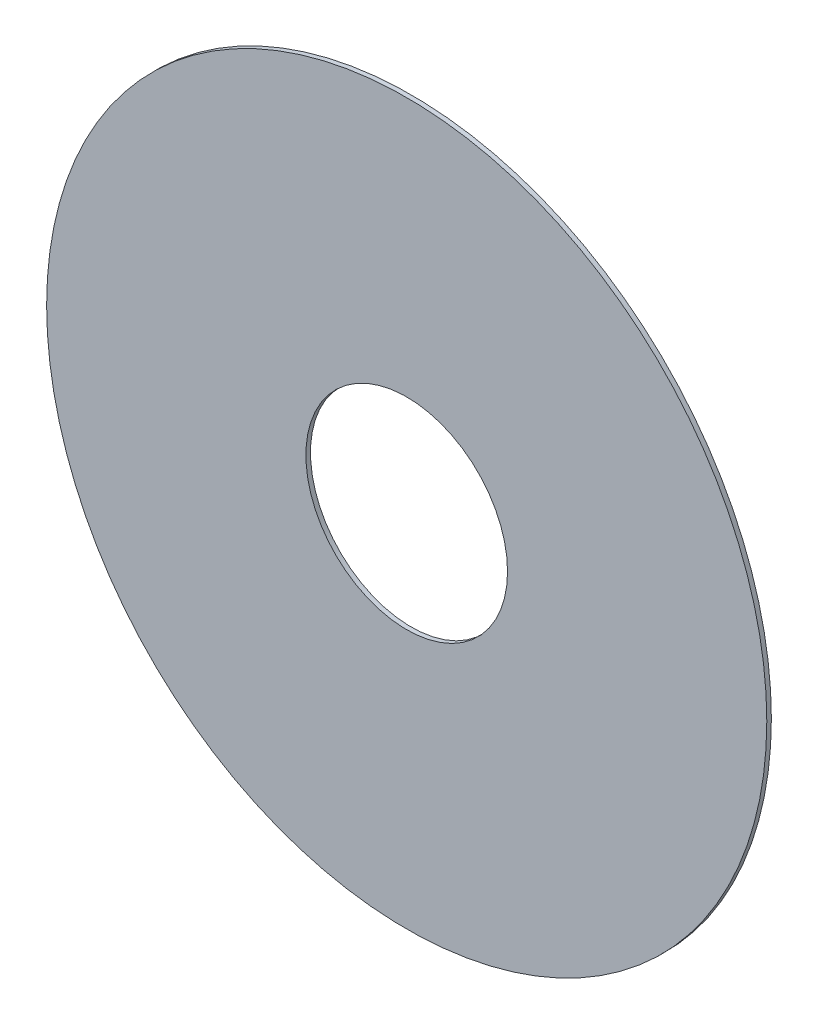
ISO-10303-21;
HEADER;
FILE_DESCRIPTION(('STEP AP214'),'2;1');
FILE_NAME('part.step','',(''),(''),'','','');
FILE_SCHEMA(('AUTOMOTIVE_DESIGN { 1 0 10303 214 1 1 1 1 }'));
ENDSEC;
DATA;
#1=APPLICATION_CONTEXT('core data for automotive mechanical design processes');
#2=APPLICATION_PROTOCOL_DEFINITION('international standard','automotive_design',2000,#1);
#3=PRODUCT_CONTEXT('',#1,'mechanical');
#4=PRODUCT('Part','Part','',(#3));
#5=PRODUCT_RELATED_PRODUCT_CATEGORY('part','',(#4));
#6=PRODUCT_DEFINITION_FORMATION('','',#4);
#7=PRODUCT_DEFINITION_CONTEXT('part definition',#1,'design');
#8=PRODUCT_DEFINITION('design','',#6,#7);
#9=PRODUCT_DEFINITION_SHAPE('','',#8);
#10=(LENGTH_UNIT() NAMED_UNIT(*) SI_UNIT(.MILLI.,.METRE.));
#11=(NAMED_UNIT(*) PLANE_ANGLE_UNIT() SI_UNIT($,.RADIAN.));
#12=(NAMED_UNIT(*) SI_UNIT($,.STERADIAN.) SOLID_ANGLE_UNIT());
#13=UNCERTAINTY_MEASURE_WITH_UNIT(LENGTH_MEASURE(1.E-05),#10,'distance_accuracy_value','');
#14=(GEOMETRIC_REPRESENTATION_CONTEXT(3) GLOBAL_UNCERTAINTY_ASSIGNED_CONTEXT((#13)) GLOBAL_UNIT_ASSIGNED_CONTEXT((#10,
#11,#12)) REPRESENTATION_CONTEXT('',''));
#15=CARTESIAN_POINT('',(0.,0.,0.));
#16=DIRECTION('',(0.,0.,1.));
#17=DIRECTION('',(1.,0.,0.));
#18=AXIS2_PLACEMENT_3D('',#15,#16,#17);
#19=CARTESIAN_POINT('',(0.,0.,3.175));
#20=DIRECTION('',(0.,0.,-1.));
#21=DIRECTION('',(-1.,0.,0.));
#22=AXIS2_PLACEMENT_3D('',#19,#20,#21);
#23=CYLINDRICAL_SURFACE('',#22,250.);
#24=CARTESIAN_POINT('',(0.,0.,3.175));
#25=DIRECTION('',(0.,0.,1.));
#26=DIRECTION('',(1.,0.,0.));
#27=AXIS2_PLACEMENT_3D('',#24,#25,#26);
#28=CIRCLE('',#27,250.);
#29=CARTESIAN_POINT('',(250.,0.,3.175));
#30=VERTEX_POINT('',#29);
#31=EDGE_CURVE('E10',#30,#30,#28,.T.);
#32=ORIENTED_EDGE('',*,*,#31,.F.);
#33=EDGE_LOOP('',(#32));
#34=FACE_BOUND('',#33,.T.);
#35=CARTESIAN_POINT('',(0.,0.,0.));
#36=DIRECTION('',(0.,0.,1.));
#37=DIRECTION('',(1.,0.,0.));
#38=AXIS2_PLACEMENT_3D('',#35,#36,#37);
#39=CIRCLE('',#38,250.);
#40=CARTESIAN_POINT('',(250.,0.,0.));
#41=VERTEX_POINT('',#40);
#42=EDGE_CURVE('E33',#41,#41,#39,.T.);
#43=ORIENTED_EDGE('',*,*,#42,.T.);
#44=EDGE_LOOP('',(#43));
#45=FACE_BOUND('',#44,.T.);
#46=ADVANCED_FACE('F30',(#34,#45),#23,.T.);
#47=CARTESIAN_POINT('',(0.,0.,3.175));
#48=DIRECTION('',(0.,0.,1.));
#49=DIRECTION('',(1.,0.,0.));
#50=AXIS2_PLACEMENT_3D('',#47,#48,#49);
#51=PLANE('',#50);
#52=CARTESIAN_POINT('',(0.,0.,3.175));
#53=DIRECTION('',(0.,0.,1.));
#54=DIRECTION('',(1.,0.,0.));
#55=AXIS2_PLACEMENT_3D('',#52,#53,#54);
#56=CIRCLE('',#55,70.);
#57=CARTESIAN_POINT('',(70.,0.,3.175));
#58=VERTEX_POINT('',#57);
#59=EDGE_CURVE('E42',#58,#58,#56,.T.);
#60=ORIENTED_EDGE('',*,*,#59,.F.);
#61=EDGE_LOOP('',(#60));
#62=FACE_BOUND('',#61,.T.);
#63=ORIENTED_EDGE('',*,*,#31,.T.);
#64=EDGE_LOOP('',(#63));
#65=FACE_BOUND('',#64,.T.);
#66=ADVANCED_FACE('F57',(#62,#65),#51,.T.);
#67=CARTESIAN_POINT('',(0.,0.,0.));
#68=DIRECTION('',(0.,0.,1.));
#69=DIRECTION('',(1.,0.,0.));
#70=AXIS2_PLACEMENT_3D('',#67,#68,#69);
#71=PLANE('',#70);
#72=CARTESIAN_POINT('',(0.,0.,0.));
#73=DIRECTION('',(0.,0.,1.));
#74=DIRECTION('',(1.,0.,0.));
#75=AXIS2_PLACEMENT_3D('',#72,#73,#74);
#76=CIRCLE('',#75,70.);
#77=CARTESIAN_POINT('',(70.,0.,0.));
#78=VERTEX_POINT('',#77);
#79=EDGE_CURVE('E40',#78,#78,#76,.T.);
#80=ORIENTED_EDGE('',*,*,#79,.T.);
#81=EDGE_LOOP('',(#80));
#82=FACE_BOUND('',#81,.T.);
#83=ORIENTED_EDGE('',*,*,#42,.F.);
#84=EDGE_LOOP('',(#83));
#85=FACE_BOUND('',#84,.T.);
#86=ADVANCED_FACE('F48',(#82,#85),#71,.F.);
#87=CARTESIAN_POINT('',(0.,0.,0.));
#88=DIRECTION('',(0.,0.,1.));
#89=DIRECTION('',(1.,0.,0.));
#90=AXIS2_PLACEMENT_3D('',#87,#88,#89);
#91=CYLINDRICAL_SURFACE('',#90,70.);
#92=ORIENTED_EDGE('',*,*,#79,.F.);
#93=EDGE_LOOP('',(#92));
#94=FACE_BOUND('',#93,.T.);
#95=ORIENTED_EDGE('',*,*,#59,.T.);
#96=EDGE_LOOP('',(#95));
#97=FACE_BOUND('',#96,.T.);
#98=ADVANCED_FACE('F51',(#94,#97),#91,.F.);
#99=CLOSED_SHELL('',(#46,#66,#86,#98));
#100=MANIFOLD_SOLID_BREP('B2',#99);
#101=ADVANCED_BREP_SHAPE_REPRESENTATION('',(#18,#100),#14);
#102=SHAPE_DEFINITION_REPRESENTATION(#9,#101);
ENDSEC;
END-ISO-10303-21;
